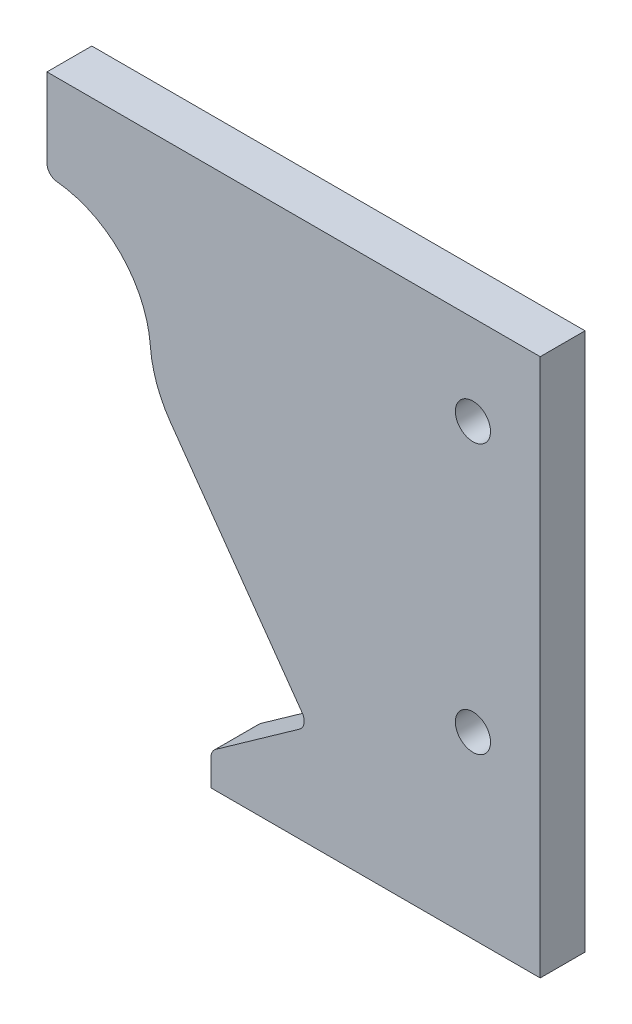
ISO-10303-21;
HEADER;
FILE_DESCRIPTION(('STEP AP214'),'2;1');
FILE_NAME('part.step','',(''),(''),'','','');
FILE_SCHEMA(('AUTOMOTIVE_DESIGN { 1 0 10303 214 1 1 1 1 }'));
ENDSEC;
DATA;
#1=APPLICATION_CONTEXT('core data for automotive mechanical design processes');
#2=APPLICATION_PROTOCOL_DEFINITION('international standard','automotive_design',2000,#1);
#3=PRODUCT_CONTEXT('',#1,'mechanical');
#4=PRODUCT('Part','Part','',(#3));
#5=PRODUCT_RELATED_PRODUCT_CATEGORY('part','',(#4));
#6=PRODUCT_DEFINITION_FORMATION('','',#4);
#7=PRODUCT_DEFINITION_CONTEXT('part definition',#1,'design');
#8=PRODUCT_DEFINITION('design','',#6,#7);
#9=PRODUCT_DEFINITION_SHAPE('','',#8);
#10=(LENGTH_UNIT() NAMED_UNIT(*) SI_UNIT(.MILLI.,.METRE.));
#11=(NAMED_UNIT(*) PLANE_ANGLE_UNIT() SI_UNIT($,.RADIAN.));
#12=(NAMED_UNIT(*) SI_UNIT($,.STERADIAN.) SOLID_ANGLE_UNIT());
#13=UNCERTAINTY_MEASURE_WITH_UNIT(LENGTH_MEASURE(1.E-05),#10,'distance_accuracy_value','');
#14=(GEOMETRIC_REPRESENTATION_CONTEXT(3) GLOBAL_UNCERTAINTY_ASSIGNED_CONTEXT((#13)) GLOBAL_UNIT_ASSIGNED_CONTEXT((#10,
#11,#12)) REPRESENTATION_CONTEXT('',''));
#15=CARTESIAN_POINT('',(0.,0.,0.));
#16=DIRECTION('',(0.,0.,1.));
#17=DIRECTION('',(1.,0.,0.));
#18=AXIS2_PLACEMENT_3D('',#15,#16,#17);
#19=CARTESIAN_POINT('',(0.,0.,3.175));
#20=DIRECTION('',(0.,0.,1.));
#21=DIRECTION('',(1.,0.,0.));
#22=AXIS2_PLACEMENT_3D('',#19,#20,#21);
#23=PLANE('',#22);
#24=CARTESIAN_POINT('',(60.325,14.6812,3.175));
#25=DIRECTION('',(0.,0.,1.));
#26=DIRECTION('',(1.,0.,0.));
#27=AXIS2_PLACEMENT_3D('',#24,#25,#26);
#28=CIRCLE('',#27,2.4892);
#29=CARTESIAN_POINT('',(62.8142,14.6812,3.175));
#30=VERTEX_POINT('',#29);
#31=EDGE_CURVE('E243',#30,#30,#28,.T.);
#32=ORIENTED_EDGE('',*,*,#31,.F.);
#33=EDGE_LOOP('',(#32));
#34=FACE_BOUND('',#33,.T.);
#35=DIRECTION('',(0.,-1.,0.));
#36=VECTOR('',#35,1.);
#37=CARTESIAN_POINT('',(0.,14.6812,3.175));
#38=LINE('',#37,#36);
#39=CARTESIAN_POINT('',(0.,27.3812,3.175));
#40=VERTEX_POINT('',#39);
#41=CARTESIAN_POINT('',(0.,16.1910606026906,3.175));
#42=VERTEX_POINT('',#41);
#43=EDGE_CURVE('E237',#40,#42,#38,.T.);
#44=ORIENTED_EDGE('',*,*,#43,.T.);
#45=CARTESIAN_POINT('',(1.58749999999995,16.1910606026906,3.175));
#46=DIRECTION('',(0.,0.,1.));
#47=DIRECTION('',(1.,0.,0.));
#48=AXIS2_PLACEMENT_3D('',#45,#46,#47);
#49=CIRCLE('',#48,1.5875);
#50=CARTESIAN_POINT('',(1.43259172521464,14.6111366562922,3.175));
#51=VERTEX_POINT('',#50);
#52=EDGE_CURVE('E138',#42,#51,#49,.T.);
#53=ORIENTED_EDGE('',*,*,#52,.T.);
#54=CARTESIAN_POINT('',(0.,0.,3.175));
#55=DIRECTION('',(0.,0.,-1.));
#56=DIRECTION('',(1.,0.,0.));
#57=AXIS2_PLACEMENT_3D('',#54,#55,#56);
#58=CIRCLE('',#57,14.6812);
#59=CARTESIAN_POINT('',(14.6391568085926,1.11027986266354,3.175));
#60=VERTEX_POINT('',#59);
#61=EDGE_CURVE('E131',#51,#60,#58,.T.);
#62=ORIENTED_EDGE('',*,*,#61,.T.);
#63=CARTESIAN_POINT('',(30.4686948801661,2.31084199789658,3.175));
#64=DIRECTION('',(0.,0.,1.));
#65=DIRECTION('',(-1.,0.,0.));
#66=AXIS2_PLACEMENT_3D('',#63,#64,#65);
#67=CIRCLE('',#66,15.8749999999984);
#68=CARTESIAN_POINT('',(17.5173156414515,-6.86943037360434,3.175));
#69=VERTEX_POINT('',#68);
#70=EDGE_CURVE('E135',#60,#69,#67,.T.);
#71=ORIENTED_EDGE('',*,*,#70,.T.);
#72=DIRECTION('',(0.578284873795388,-0.815834912675017,0.));
#73=VECTOR('',#72,1.);
#74=CARTESIAN_POINT('',(37.0529352480079,-34.4299653935926,3.175));
#75=LINE('',#74,#73);
#76=CARTESIAN_POINT('',(36.1349080108577,-33.134827469721,3.175));
#77=VERTEX_POINT('',#76);
#78=EDGE_CURVE('E154',#69,#77,#75,.T.);
#79=ORIENTED_EDGE('',*,*,#78,.T.);
#80=CARTESIAN_POINT('',(34.8397700869862,-34.0528547068712,3.175));
#81=DIRECTION('',(0.,0.,1.));
#82=DIRECTION('',(1.,0.,0.));
#83=AXIS2_PLACEMENT_3D('',#80,#81,#82);
#84=CIRCLE('',#83,1.5875);
#85=CARTESIAN_POINT('',(35.7577973241363,-35.3479926307428,3.175));
#86=VERTEX_POINT('',#85);
#87=EDGE_CURVE('E11',#77,#86,#84,.F.);
#88=ORIENTED_EDGE('',*,*,#87,.T.);
#89=DIRECTION('',(-0.815834912675017,-0.578284873795388,0.));
#90=VECTOR('',#89,1.);
#91=CARTESIAN_POINT('',(23.2296452548892,-44.2282706449542,3.175));
#92=LINE('',#91,#90);
#93=CARTESIAN_POINT('',(23.899118017739,-43.753731046122,3.175));
#94=VERTEX_POINT('',#93);
#95=EDGE_CURVE('E216',#86,#94,#92,.T.);
#96=ORIENTED_EDGE('',*,*,#95,.T.);
#97=CARTESIAN_POINT('',(24.8171452548892,-45.0488689699936,3.175));
#98=DIRECTION('',(0.,0.,1.));
#99=DIRECTION('',(1.,0.,0.));
#100=AXIS2_PLACEMENT_3D('',#97,#98,#99);
#101=CIRCLE('',#100,1.5875);
#102=CARTESIAN_POINT('',(23.2296452548892,-45.0488689699936,3.175));
#103=VERTEX_POINT('',#102);
#104=EDGE_CURVE('E57',#94,#103,#101,.T.);
#105=ORIENTED_EDGE('',*,*,#104,.T.);
#106=DIRECTION('',(0.,-1.,0.));
#107=VECTOR('',#106,1.);
#108=CARTESIAN_POINT('',(23.2296452548892,-48.8188,3.175));
#109=LINE('',#108,#107);
#110=CARTESIAN_POINT('',(23.2296452548892,-48.8188,3.175));
#111=VERTEX_POINT('',#110);
#112=EDGE_CURVE('E221',#103,#111,#109,.T.);
#113=ORIENTED_EDGE('',*,*,#112,.T.);
#114=DIRECTION('',(1.,0.,0.));
#115=VECTOR('',#114,1.);
#116=CARTESIAN_POINT('',(69.85,-48.8188,3.175));
#117=LINE('',#116,#115);
#118=CARTESIAN_POINT('',(69.85,-48.8188,3.175));
#119=VERTEX_POINT('',#118);
#120=EDGE_CURVE('E225',#111,#119,#117,.T.);
#121=ORIENTED_EDGE('',*,*,#120,.T.);
#122=DIRECTION('',(0.,1.,0.));
#123=VECTOR('',#122,1.);
#124=CARTESIAN_POINT('',(69.85,27.3812,3.175));
#125=LINE('',#124,#123);
#126=CARTESIAN_POINT('',(69.85,27.3812,3.175));
#127=VERTEX_POINT('',#126);
#128=EDGE_CURVE('E231',#119,#127,#125,.T.);
#129=ORIENTED_EDGE('',*,*,#128,.T.);
#130=DIRECTION('',(-1.,0.,0.));
#131=VECTOR('',#130,1.);
#132=CARTESIAN_POINT('',(0.,27.3812,3.175));
#133=LINE('',#132,#131);
#134=EDGE_CURVE('E234',#127,#40,#133,.T.);
#135=ORIENTED_EDGE('',*,*,#134,.T.);
#136=EDGE_LOOP('',(#44,#53,#62,#71,#79,#88,#96,#105,#113,#121,#129,#135));
#137=FACE_BOUND('',#136,.T.);
#138=CARTESIAN_POINT('',(60.325,-23.4188,3.175));
#139=DIRECTION('',(0.,0.,1.));
#140=DIRECTION('',(1.,0.,0.));
#141=AXIS2_PLACEMENT_3D('',#138,#139,#140);
#142=CIRCLE('',#141,2.4892);
#143=CARTESIAN_POINT('',(62.8142,-23.4188,3.175));
#144=VERTEX_POINT('',#143);
#145=EDGE_CURVE('E346',#144,#144,#142,.T.);
#146=ORIENTED_EDGE('',*,*,#145,.F.);
#147=EDGE_LOOP('',(#146));
#148=FACE_BOUND('',#147,.T.);
#149=ADVANCED_FACE('F41',(#34,#137,#148),#23,.T.);
#150=CARTESIAN_POINT('',(0.,0.,-3.175));
#151=DIRECTION('',(0.,0.,1.));
#152=DIRECTION('',(1.,0.,0.));
#153=AXIS2_PLACEMENT_3D('',#150,#151,#152);
#154=PLANE('',#153);
#155=CARTESIAN_POINT('',(0.,0.,-3.175));
#156=DIRECTION('',(0.,0.,-1.));
#157=DIRECTION('',(1.,0.,0.));
#158=AXIS2_PLACEMENT_3D('',#155,#156,#157);
#159=CIRCLE('',#158,14.6812);
#160=CARTESIAN_POINT('',(1.43259172521464,14.6111366562922,-3.175));
#161=VERTEX_POINT('',#160);
#162=CARTESIAN_POINT('',(14.6391568085926,1.11027986266354,-3.175));
#163=VERTEX_POINT('',#162);
#164=EDGE_CURVE('E158',#161,#163,#159,.T.);
#165=ORIENTED_EDGE('',*,*,#164,.F.);
#166=CARTESIAN_POINT('',(1.58749999999995,16.1910606026906,-3.175));
#167=DIRECTION('',(0.,0.,1.));
#168=DIRECTION('',(1.,0.,0.));
#169=AXIS2_PLACEMENT_3D('',#166,#167,#168);
#170=CIRCLE('',#169,1.5875);
#171=CARTESIAN_POINT('',(0.,16.1910606026906,-3.175));
#172=VERTEX_POINT('',#171);
#173=EDGE_CURVE('E183',#161,#172,#170,.F.);
#174=ORIENTED_EDGE('',*,*,#173,.T.);
#175=DIRECTION('',(0.,-1.,0.));
#176=VECTOR('',#175,1.);
#177=CARTESIAN_POINT('',(0.,14.6812,-3.175));
#178=LINE('',#177,#176);
#179=CARTESIAN_POINT('',(0.,27.3812,-3.175));
#180=VERTEX_POINT('',#179);
#181=EDGE_CURVE('E144',#180,#172,#178,.T.);
#182=ORIENTED_EDGE('',*,*,#181,.F.);
#183=DIRECTION('',(-1.,0.,0.));
#184=VECTOR('',#183,1.);
#185=CARTESIAN_POINT('',(0.,27.3812,-3.175));
#186=LINE('',#185,#184);
#187=CARTESIAN_POINT('',(69.85,27.3812,-3.175));
#188=VERTEX_POINT('',#187);
#189=EDGE_CURVE('E257',#188,#180,#186,.T.);
#190=ORIENTED_EDGE('',*,*,#189,.F.);
#191=DIRECTION('',(0.,1.,0.));
#192=VECTOR('',#191,1.);
#193=CARTESIAN_POINT('',(69.85,27.3812,-3.175));
#194=LINE('',#193,#192);
#195=CARTESIAN_POINT('',(69.85,-48.8188,-3.175));
#196=VERTEX_POINT('',#195);
#197=EDGE_CURVE('E254',#196,#188,#194,.T.);
#198=ORIENTED_EDGE('',*,*,#197,.F.);
#199=DIRECTION('',(1.,0.,0.));
#200=VECTOR('',#199,1.);
#201=CARTESIAN_POINT('',(69.85,-48.8188,-3.175));
#202=LINE('',#201,#200);
#203=CARTESIAN_POINT('',(23.2296452548892,-48.8188,-3.175));
#204=VERTEX_POINT('',#203);
#205=EDGE_CURVE('E251',#204,#196,#202,.T.);
#206=ORIENTED_EDGE('',*,*,#205,.F.);
#207=DIRECTION('',(0.,-1.,0.));
#208=VECTOR('',#207,1.);
#209=CARTESIAN_POINT('',(23.2296452548892,-48.8188,-3.175));
#210=LINE('',#209,#208);
#211=CARTESIAN_POINT('',(23.2296452548892,-45.0488689699936,-3.175));
#212=VERTEX_POINT('',#211);
#213=EDGE_CURVE('E248',#212,#204,#210,.T.);
#214=ORIENTED_EDGE('',*,*,#213,.F.);
#215=CARTESIAN_POINT('',(24.8171452548892,-45.0488689699936,-3.175));
#216=DIRECTION('',(0.,0.,1.));
#217=DIRECTION('',(1.,0.,0.));
#218=AXIS2_PLACEMENT_3D('',#215,#216,#217);
#219=CIRCLE('',#218,1.5875);
#220=CARTESIAN_POINT('',(23.899118017739,-43.753731046122,-3.175));
#221=VERTEX_POINT('',#220);
#222=EDGE_CURVE('E180',#212,#221,#219,.F.);
#223=ORIENTED_EDGE('',*,*,#222,.T.);
#224=DIRECTION('',(-0.815834912675017,-0.578284873795388,0.));
#225=VECTOR('',#224,1.);
#226=CARTESIAN_POINT('',(23.2296452548892,-44.2282706449542,-3.175));
#227=LINE('',#226,#225);
#228=CARTESIAN_POINT('',(35.7577973241363,-35.3479926307428,-3.175));
#229=VERTEX_POINT('',#228);
#230=EDGE_CURVE('E204',#229,#221,#227,.T.);
#231=ORIENTED_EDGE('',*,*,#230,.F.);
#232=CARTESIAN_POINT('',(34.8397700869862,-34.0528547068712,-3.175));
#233=DIRECTION('',(0.,0.,1.));
#234=DIRECTION('',(1.,0.,0.));
#235=AXIS2_PLACEMENT_3D('',#232,#233,#234);
#236=CIRCLE('',#235,1.5875);
#237=CARTESIAN_POINT('',(36.1349080108577,-33.134827469721,-3.175));
#238=VERTEX_POINT('',#237);
#239=EDGE_CURVE('E50',#229,#238,#236,.T.);
#240=ORIENTED_EDGE('',*,*,#239,.T.);
#241=DIRECTION('',(0.578284873795388,-0.815834912675017,0.));
#242=VECTOR('',#241,1.);
#243=CARTESIAN_POINT('',(37.0529352480079,-34.4299653935926,-3.175));
#244=LINE('',#243,#242);
#245=CARTESIAN_POINT('',(17.5173156414515,-6.86943037360434,-3.175));
#246=VERTEX_POINT('',#245);
#247=EDGE_CURVE('E202',#246,#238,#244,.T.);
#248=ORIENTED_EDGE('',*,*,#247,.F.);
#249=CARTESIAN_POINT('',(30.4686948801661,2.31084199789658,-3.175));
#250=DIRECTION('',(0.,0.,1.));
#251=DIRECTION('',(-1.,0.,0.));
#252=AXIS2_PLACEMENT_3D('',#249,#250,#251);
#253=CIRCLE('',#252,15.8749999999984);
#254=EDGE_CURVE('E211',#163,#246,#253,.T.);
#255=ORIENTED_EDGE('',*,*,#254,.F.);
#256=EDGE_LOOP('',(#165,#174,#182,#190,#198,#206,#214,#223,#231,#240,#248,#255));
#257=FACE_BOUND('',#256,.T.);
#258=CARTESIAN_POINT('',(60.325,14.6812,-3.175));
#259=DIRECTION('',(0.,0.,1.));
#260=DIRECTION('',(1.,0.,0.));
#261=AXIS2_PLACEMENT_3D('',#258,#259,#260);
#262=CIRCLE('',#261,2.4892);
#263=CARTESIAN_POINT('',(62.8142,14.6812,-3.175));
#264=VERTEX_POINT('',#263);
#265=EDGE_CURVE('E354',#264,#264,#262,.T.);
#266=ORIENTED_EDGE('',*,*,#265,.T.);
#267=EDGE_LOOP('',(#266));
#268=FACE_BOUND('',#267,.T.);
#269=CARTESIAN_POINT('',(60.325,-23.4188,-3.175));
#270=DIRECTION('',(0.,0.,1.));
#271=DIRECTION('',(1.,0.,0.));
#272=AXIS2_PLACEMENT_3D('',#269,#270,#271);
#273=CIRCLE('',#272,2.4892);
#274=CARTESIAN_POINT('',(62.8142,-23.4188,-3.175));
#275=VERTEX_POINT('',#274);
#276=EDGE_CURVE('E349',#275,#275,#273,.T.);
#277=ORIENTED_EDGE('',*,*,#276,.T.);
#278=EDGE_LOOP('',(#277));
#279=FACE_BOUND('',#278,.T.);
#280=ADVANCED_FACE('F200',(#257,#268,#279),#154,.F.);
#281=CARTESIAN_POINT('',(0.,0.,3.175));
#282=DIRECTION('',(0.,0.,-1.));
#283=DIRECTION('',(-1.,0.,0.));
#284=AXIS2_PLACEMENT_3D('',#281,#282,#283);
#285=CYLINDRICAL_SURFACE('',#284,14.6812);
#286=ORIENTED_EDGE('',*,*,#61,.F.);
#287=DIRECTION('',(0.,0.,-1.));
#288=VECTOR('',#287,1.);
#289=CARTESIAN_POINT('',(1.43259172521464,14.6111366562922,3.175));
#290=LINE('',#289,#288);
#291=EDGE_CURVE('E177',#51,#161,#290,.T.);
#292=ORIENTED_EDGE('',*,*,#291,.T.);
#293=ORIENTED_EDGE('',*,*,#164,.T.);
#294=DIRECTION('',(0.,0.,-1.));
#295=VECTOR('',#294,1.);
#296=CARTESIAN_POINT('',(14.6391568085926,1.11027986266354,3.175));
#297=LINE('',#296,#295);
#298=EDGE_CURVE('E149',#60,#163,#297,.T.);
#299=ORIENTED_EDGE('',*,*,#298,.F.);
#300=EDGE_LOOP('',(#286,#292,#293,#299));
#301=FACE_BOUND('',#300,.T.);
#302=ADVANCED_FACE('F156',(#301),#285,.F.);
#303=CARTESIAN_POINT('',(30.4686948801661,2.31084199789658,3.175));
#304=DIRECTION('',(0.,0.,-1.));
#305=DIRECTION('',(-1.,0.,0.));
#306=AXIS2_PLACEMENT_3D('',#303,#304,#305);
#307=CYLINDRICAL_SURFACE('',#306,15.8749999999984);
#308=ORIENTED_EDGE('',*,*,#254,.T.);
#309=DIRECTION('',(0.,0.,-1.));
#310=VECTOR('',#309,1.);
#311=CARTESIAN_POINT('',(17.5173156414515,-6.86943037360434,3.175));
#312=LINE('',#311,#310);
#313=EDGE_CURVE('E151',#69,#246,#312,.T.);
#314=ORIENTED_EDGE('',*,*,#313,.F.);
#315=ORIENTED_EDGE('',*,*,#70,.F.);
#316=ORIENTED_EDGE('',*,*,#298,.T.);
#317=EDGE_LOOP('',(#308,#314,#315,#316));
#318=FACE_BOUND('',#317,.T.);
#319=ADVANCED_FACE('F148',(#318),#307,.T.);
#320=CARTESIAN_POINT('',(37.0529352480079,-34.4299653935926,3.175));
#321=DIRECTION('',(0.815834912675017,0.578284873795388,0.));
#322=DIRECTION('',(-0.578284873795388,0.815834912675017,0.));
#323=AXIS2_PLACEMENT_3D('',#320,#321,#322);
#324=PLANE('',#323);
#325=ORIENTED_EDGE('',*,*,#247,.T.);
#326=DIRECTION('',(0.,0.,-1.));
#327=VECTOR('',#326,1.);
#328=CARTESIAN_POINT('',(36.1349080108577,-33.134827469721,3.175));
#329=LINE('',#328,#327);
#330=EDGE_CURVE('E174',#238,#77,#329,.F.);
#331=ORIENTED_EDGE('',*,*,#330,.T.);
#332=ORIENTED_EDGE('',*,*,#78,.F.);
#333=ORIENTED_EDGE('',*,*,#313,.T.);
#334=EDGE_LOOP('',(#325,#331,#332,#333));
#335=FACE_BOUND('',#334,.T.);
#336=ADVANCED_FACE('F209',(#335),#324,.F.);
#337=CARTESIAN_POINT('',(23.2296452548892,-44.2282706449542,3.175));
#338=DIRECTION('',(0.578284873795388,-0.815834912675017,0.));
#339=DIRECTION('',(0.815834912675017,0.578284873795388,0.));
#340=AXIS2_PLACEMENT_3D('',#337,#338,#339);
#341=PLANE('',#340);
#342=ORIENTED_EDGE('',*,*,#95,.F.);
#343=DIRECTION('',(0.,0.,-1.));
#344=VECTOR('',#343,1.);
#345=CARTESIAN_POINT('',(35.7577973241363,-35.3479926307428,-3.175));
#346=LINE('',#345,#344);
#347=EDGE_CURVE('E165',#86,#229,#346,.T.);
#348=ORIENTED_EDGE('',*,*,#347,.T.);
#349=ORIENTED_EDGE('',*,*,#230,.T.);
#350=DIRECTION('',(0.,0.,-1.));
#351=VECTOR('',#350,1.);
#352=CARTESIAN_POINT('',(23.899118017739,-43.753731046122,3.175));
#353=LINE('',#352,#351);
#354=EDGE_CURVE('E161',#221,#94,#353,.F.);
#355=ORIENTED_EDGE('',*,*,#354,.T.);
#356=EDGE_LOOP('',(#342,#348,#349,#355));
#357=FACE_BOUND('',#356,.T.);
#358=ADVANCED_FACE('F218',(#357),#341,.F.);
#359=CARTESIAN_POINT('',(23.2296452548892,-48.8188,3.175));
#360=DIRECTION('',(1.,0.,0.));
#361=DIRECTION('',(0.,0.,-1.));
#362=AXIS2_PLACEMENT_3D('',#359,#360,#361);
#363=PLANE('',#362);
#364=ORIENTED_EDGE('',*,*,#112,.F.);
#365=DIRECTION('',(0.,0.,-1.));
#366=VECTOR('',#365,1.);
#367=CARTESIAN_POINT('',(23.2296452548892,-45.0488689699936,3.175));
#368=LINE('',#367,#366);
#369=EDGE_CURVE('E192',#103,#212,#368,.T.);
#370=ORIENTED_EDGE('',*,*,#369,.T.);
#371=ORIENTED_EDGE('',*,*,#213,.T.);
#372=DIRECTION('',(0.,0.,-1.));
#373=VECTOR('',#372,1.);
#374=CARTESIAN_POINT('',(23.2296452548892,-48.8188,3.175));
#375=LINE('',#374,#373);
#376=EDGE_CURVE('E167',#111,#204,#375,.T.);
#377=ORIENTED_EDGE('',*,*,#376,.F.);
#378=EDGE_LOOP('',(#364,#370,#371,#377));
#379=FACE_BOUND('',#378,.T.);
#380=ADVANCED_FACE('F294',(#379),#363,.F.);
#381=CARTESIAN_POINT('',(69.85,-48.8188,3.175));
#382=DIRECTION('',(0.,1.,0.));
#383=DIRECTION('',(0.,0.,1.));
#384=AXIS2_PLACEMENT_3D('',#381,#382,#383);
#385=PLANE('',#384);
#386=ORIENTED_EDGE('',*,*,#205,.T.);
#387=DIRECTION('',(0.,0.,-1.));
#388=VECTOR('',#387,1.);
#389=CARTESIAN_POINT('',(69.85,-48.8188,3.175));
#390=LINE('',#389,#388);
#391=EDGE_CURVE('E269',#119,#196,#390,.T.);
#392=ORIENTED_EDGE('',*,*,#391,.F.);
#393=ORIENTED_EDGE('',*,*,#120,.F.);
#394=ORIENTED_EDGE('',*,*,#376,.T.);
#395=EDGE_LOOP('',(#386,#392,#393,#394));
#396=FACE_BOUND('',#395,.T.);
#397=ADVANCED_FACE('F278',(#396),#385,.F.);
#398=CARTESIAN_POINT('',(69.85,27.3812,3.175));
#399=DIRECTION('',(-1.,0.,0.));
#400=DIRECTION('',(0.,-1.,0.));
#401=AXIS2_PLACEMENT_3D('',#398,#399,#400);
#402=PLANE('',#401);
#403=ORIENTED_EDGE('',*,*,#197,.T.);
#404=DIRECTION('',(0.,0.,-1.));
#405=VECTOR('',#404,1.);
#406=CARTESIAN_POINT('',(69.85,27.3812,3.175));
#407=LINE('',#406,#405);
#408=EDGE_CURVE('E265',#127,#188,#407,.T.);
#409=ORIENTED_EDGE('',*,*,#408,.F.);
#410=ORIENTED_EDGE('',*,*,#128,.F.);
#411=ORIENTED_EDGE('',*,*,#391,.T.);
#412=EDGE_LOOP('',(#403,#409,#410,#411));
#413=FACE_BOUND('',#412,.T.);
#414=ADVANCED_FACE('F287',(#413),#402,.F.);
#415=CARTESIAN_POINT('',(0.,27.3812,3.175));
#416=DIRECTION('',(0.,-1.,0.));
#417=DIRECTION('',(0.,0.,-1.));
#418=AXIS2_PLACEMENT_3D('',#415,#416,#417);
#419=PLANE('',#418);
#420=ORIENTED_EDGE('',*,*,#189,.T.);
#421=DIRECTION('',(0.,0.,-1.));
#422=VECTOR('',#421,1.);
#423=CARTESIAN_POINT('',(0.,27.3812,3.175));
#424=LINE('',#423,#422);
#425=EDGE_CURVE('E240',#40,#180,#424,.T.);
#426=ORIENTED_EDGE('',*,*,#425,.F.);
#427=ORIENTED_EDGE('',*,*,#134,.F.);
#428=ORIENTED_EDGE('',*,*,#408,.T.);
#429=EDGE_LOOP('',(#420,#426,#427,#428));
#430=FACE_BOUND('',#429,.T.);
#431=ADVANCED_FACE('F291',(#430),#419,.F.);
#432=CARTESIAN_POINT('',(0.,14.6812,3.175));
#433=DIRECTION('',(1.,0.,0.));
#434=DIRECTION('',(0.,1.,0.));
#435=AXIS2_PLACEMENT_3D('',#432,#433,#434);
#436=PLANE('',#435);
#437=ORIENTED_EDGE('',*,*,#181,.T.);
#438=DIRECTION('',(0.,0.,-1.));
#439=VECTOR('',#438,1.);
#440=CARTESIAN_POINT('',(0.,16.1910606026906,3.175));
#441=LINE('',#440,#439);
#442=EDGE_CURVE('E65',#172,#42,#441,.F.);
#443=ORIENTED_EDGE('',*,*,#442,.T.);
#444=ORIENTED_EDGE('',*,*,#43,.F.);
#445=ORIENTED_EDGE('',*,*,#425,.T.);
#446=EDGE_LOOP('',(#437,#443,#444,#445));
#447=FACE_BOUND('',#446,.T.);
#448=ADVANCED_FACE('F314',(#447),#436,.F.);
#449=CARTESIAN_POINT('',(60.325,14.6812,3.175));
#450=DIRECTION('',(0.,0.,-1.));
#451=DIRECTION('',(-1.,0.,0.));
#452=AXIS2_PLACEMENT_3D('',#449,#450,#451);
#453=CYLINDRICAL_SURFACE('',#452,2.4892);
#454=ORIENTED_EDGE('',*,*,#31,.T.);
#455=EDGE_LOOP('',(#454));
#456=FACE_BOUND('',#455,.T.);
#457=ORIENTED_EDGE('',*,*,#265,.F.);
#458=EDGE_LOOP('',(#457));
#459=FACE_BOUND('',#458,.T.);
#460=ADVANCED_FACE('F311',(#456,#459),#453,.F.);
#461=CARTESIAN_POINT('',(60.325,-23.4188,3.175));
#462=DIRECTION('',(0.,0.,-1.));
#463=DIRECTION('',(-1.,0.,0.));
#464=AXIS2_PLACEMENT_3D('',#461,#462,#463);
#465=CYLINDRICAL_SURFACE('',#464,2.4892);
#466=ORIENTED_EDGE('',*,*,#145,.T.);
#467=EDGE_LOOP('',(#466));
#468=FACE_BOUND('',#467,.T.);
#469=ORIENTED_EDGE('',*,*,#276,.F.);
#470=EDGE_LOOP('',(#469));
#471=FACE_BOUND('',#470,.T.);
#472=ADVANCED_FACE('F334',(#468,#471),#465,.F.);
#473=CARTESIAN_POINT('',(34.8397700869862,-34.0528547068712,3.175));
#474=DIRECTION('',(0.,0.,1.));
#475=DIRECTION('',(1.,0.,0.));
#476=AXIS2_PLACEMENT_3D('',#473,#474,#475);
#477=CYLINDRICAL_SURFACE('',#476,1.5875);
#478=ORIENTED_EDGE('',*,*,#87,.F.);
#479=ORIENTED_EDGE('',*,*,#330,.F.);
#480=ORIENTED_EDGE('',*,*,#239,.F.);
#481=ORIENTED_EDGE('',*,*,#347,.F.);
#482=EDGE_LOOP('',(#478,#479,#480,#481));
#483=FACE_BOUND('',#482,.T.);
#484=ADVANCED_FACE('F214',(#483),#477,.F.);
#485=CARTESIAN_POINT('',(1.58749999999995,16.1910606026906,3.175));
#486=DIRECTION('',(0.,0.,-1.));
#487=DIRECTION('',(-1.,0.,0.));
#488=AXIS2_PLACEMENT_3D('',#485,#486,#487);
#489=CYLINDRICAL_SURFACE('',#488,1.5875);
#490=ORIENTED_EDGE('',*,*,#52,.F.);
#491=ORIENTED_EDGE('',*,*,#442,.F.);
#492=ORIENTED_EDGE('',*,*,#173,.F.);
#493=ORIENTED_EDGE('',*,*,#291,.F.);
#494=EDGE_LOOP('',(#490,#491,#492,#493));
#495=FACE_BOUND('',#494,.T.);
#496=ADVANCED_FACE('F297',(#495),#489,.T.);
#497=CARTESIAN_POINT('',(24.8171452548892,-45.0488689699936,3.175));
#498=DIRECTION('',(0.,0.,-1.));
#499=DIRECTION('',(-1.,0.,0.));
#500=AXIS2_PLACEMENT_3D('',#497,#498,#499);
#501=CYLINDRICAL_SURFACE('',#500,1.5875);
#502=ORIENTED_EDGE('',*,*,#104,.F.);
#503=ORIENTED_EDGE('',*,*,#354,.F.);
#504=ORIENTED_EDGE('',*,*,#222,.F.);
#505=ORIENTED_EDGE('',*,*,#369,.F.);
#506=EDGE_LOOP('',(#502,#503,#504,#505));
#507=FACE_BOUND('',#506,.T.);
#508=ADVANCED_FACE('F43',(#507),#501,.T.);
#509=CLOSED_SHELL('',(#149,#280,#302,#319,#336,#358,#380,#397,#414,#431,#448,#460,#472,#484,
#496,#508));
#510=MANIFOLD_SOLID_BREP('B2',#509);
#511=ADVANCED_BREP_SHAPE_REPRESENTATION('',(#18,#510),#14);
#512=SHAPE_DEFINITION_REPRESENTATION(#9,#511);
ENDSEC;
END-ISO-10303-21;
